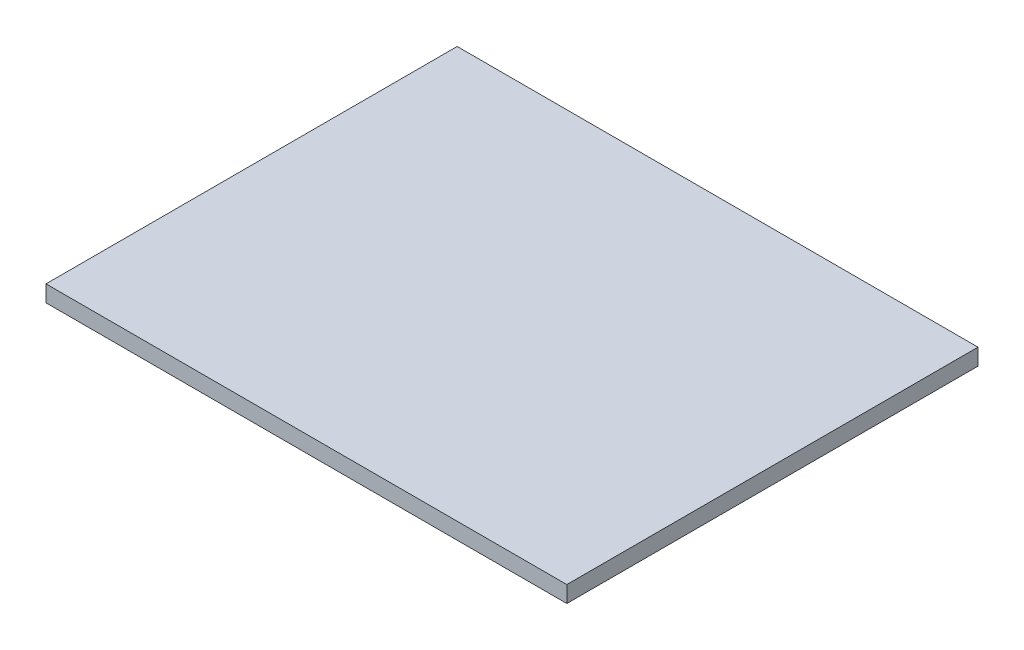
ISO-10303-21;
HEADER;
FILE_DESCRIPTION(('STEP AP214'),'2;1');
FILE_NAME('part.step','',(''),(''),'','','');
FILE_SCHEMA(('AUTOMOTIVE_DESIGN { 1 0 10303 214 1 1 1 1 }'));
ENDSEC;
DATA;
#1=APPLICATION_CONTEXT('core data for automotive mechanical design processes');
#2=APPLICATION_PROTOCOL_DEFINITION('international standard','automotive_design',2000,#1);
#3=PRODUCT_CONTEXT('',#1,'mechanical');
#4=PRODUCT('Part','Part','',(#3));
#5=PRODUCT_RELATED_PRODUCT_CATEGORY('part','',(#4));
#6=PRODUCT_DEFINITION_FORMATION('','',#4);
#7=PRODUCT_DEFINITION_CONTEXT('part definition',#1,'design');
#8=PRODUCT_DEFINITION('design','',#6,#7);
#9=PRODUCT_DEFINITION_SHAPE('','',#8);
#10=(LENGTH_UNIT() NAMED_UNIT(*) SI_UNIT(.MILLI.,.METRE.));
#11=(NAMED_UNIT(*) PLANE_ANGLE_UNIT() SI_UNIT($,.RADIAN.));
#12=(NAMED_UNIT(*) SI_UNIT($,.STERADIAN.) SOLID_ANGLE_UNIT());
#13=UNCERTAINTY_MEASURE_WITH_UNIT(LENGTH_MEASURE(1.E-05),#10,'distance_accuracy_value','');
#14=(GEOMETRIC_REPRESENTATION_CONTEXT(3) GLOBAL_UNCERTAINTY_ASSIGNED_CONTEXT((#13)) GLOBAL_UNIT_ASSIGNED_CONTEXT((#10,
#11,#12)) REPRESENTATION_CONTEXT('',''));
#15=CARTESIAN_POINT('',(0.,0.,0.));
#16=DIRECTION('',(0.,0.,1.));
#17=DIRECTION('',(1.,0.,0.));
#18=AXIS2_PLACEMENT_3D('',#15,#16,#17);
#19=CARTESIAN_POINT('',(-47.5,3.,37.5));
#20=DIRECTION('',(1.,0.,0.));
#21=DIRECTION('',(0.,0.,-1.));
#22=AXIS2_PLACEMENT_3D('',#19,#20,#21);
#23=PLANE('',#22);
#24=DIRECTION('',(0.,0.,1.));
#25=VECTOR('',#24,1.);
#26=CARTESIAN_POINT('',(-47.5,0.,37.5));
#27=LINE('',#26,#25);
#28=CARTESIAN_POINT('',(-47.5,0.,-37.5));
#29=VERTEX_POINT('',#28);
#30=CARTESIAN_POINT('',(-47.5,0.,37.5));
#31=VERTEX_POINT('',#30);
#32=EDGE_CURVE('E96',#29,#31,#27,.T.);
#33=ORIENTED_EDGE('',*,*,#32,.T.);
#34=DIRECTION('',(0.,-1.,0.));
#35=VECTOR('',#34,1.);
#36=CARTESIAN_POINT('',(-47.5,3.,37.5));
#37=LINE('',#36,#35);
#38=CARTESIAN_POINT('',(-47.5,3.,37.5));
#39=VERTEX_POINT('',#38);
#40=EDGE_CURVE('E11',#39,#31,#37,.T.);
#41=ORIENTED_EDGE('',*,*,#40,.F.);
#42=DIRECTION('',(0.,0.,1.));
#43=VECTOR('',#42,1.);
#44=CARTESIAN_POINT('',(-47.5,3.,37.5));
#45=LINE('',#44,#43);
#46=CARTESIAN_POINT('',(-47.5,3.,-37.5));
#47=VERTEX_POINT('',#46);
#48=EDGE_CURVE('E84',#47,#39,#45,.T.);
#49=ORIENTED_EDGE('',*,*,#48,.F.);
#50=DIRECTION('',(0.,-1.,0.));
#51=VECTOR('',#50,1.);
#52=CARTESIAN_POINT('',(-47.5,3.,-37.5));
#53=LINE('',#52,#51);
#54=EDGE_CURVE('E92',#47,#29,#53,.T.);
#55=ORIENTED_EDGE('',*,*,#54,.T.);
#56=EDGE_LOOP('',(#33,#41,#49,#55));
#57=FACE_BOUND('',#56,.T.);
#58=ADVANCED_FACE('F33',(#57),#23,.F.);
#59=CARTESIAN_POINT('',(47.5,3.,37.5));
#60=DIRECTION('',(0.,0.,-1.));
#61=DIRECTION('',(-1.,0.,0.));
#62=AXIS2_PLACEMENT_3D('',#59,#60,#61);
#63=PLANE('',#62);
#64=DIRECTION('',(1.,0.,0.));
#65=VECTOR('',#64,1.);
#66=CARTESIAN_POINT('',(47.5,0.,37.5));
#67=LINE('',#66,#65);
#68=CARTESIAN_POINT('',(47.5,0.,37.5));
#69=VERTEX_POINT('',#68);
#70=EDGE_CURVE('E88',#31,#69,#67,.T.);
#71=ORIENTED_EDGE('',*,*,#70,.T.);
#72=DIRECTION('',(0.,-1.,0.));
#73=VECTOR('',#72,1.);
#74=CARTESIAN_POINT('',(47.5,3.,37.5));
#75=LINE('',#74,#73);
#76=CARTESIAN_POINT('',(47.5,3.,37.5));
#77=VERTEX_POINT('',#76);
#78=EDGE_CURVE('E41',#77,#69,#75,.T.);
#79=ORIENTED_EDGE('',*,*,#78,.F.);
#80=DIRECTION('',(1.,0.,0.));
#81=VECTOR('',#80,1.);
#82=CARTESIAN_POINT('',(47.5,3.,37.5));
#83=LINE('',#82,#81);
#84=EDGE_CURVE('E79',#39,#77,#83,.T.);
#85=ORIENTED_EDGE('',*,*,#84,.F.);
#86=ORIENTED_EDGE('',*,*,#40,.T.);
#87=EDGE_LOOP('',(#71,#79,#85,#86));
#88=FACE_BOUND('',#87,.T.);
#89=ADVANCED_FACE('F87',(#88),#63,.F.);
#90=CARTESIAN_POINT('',(47.5,3.,37.5));
#91=DIRECTION('',(-1.,0.,0.));
#92=DIRECTION('',(0.,0.,1.));
#93=AXIS2_PLACEMENT_3D('',#90,#91,#92);
#94=PLANE('',#93);
#95=DIRECTION('',(0.,0.,-1.));
#96=VECTOR('',#95,1.);
#97=CARTESIAN_POINT('',(47.5,0.,37.5));
#98=LINE('',#97,#96);
#99=CARTESIAN_POINT('',(47.5,0.,-37.5));
#100=VERTEX_POINT('',#99);
#101=EDGE_CURVE('E66',#69,#100,#98,.T.);
#102=ORIENTED_EDGE('',*,*,#101,.T.);
#103=DIRECTION('',(0.,-1.,0.));
#104=VECTOR('',#103,1.);
#105=CARTESIAN_POINT('',(47.5,3.,-37.5));
#106=LINE('',#105,#104);
#107=CARTESIAN_POINT('',(47.5,3.,-37.5));
#108=VERTEX_POINT('',#107);
#109=EDGE_CURVE('E89',#108,#100,#106,.T.);
#110=ORIENTED_EDGE('',*,*,#109,.F.);
#111=DIRECTION('',(0.,0.,-1.));
#112=VECTOR('',#111,1.);
#113=CARTESIAN_POINT('',(47.5,3.,37.5));
#114=LINE('',#113,#112);
#115=EDGE_CURVE('E82',#77,#108,#114,.T.);
#116=ORIENTED_EDGE('',*,*,#115,.F.);
#117=ORIENTED_EDGE('',*,*,#78,.T.);
#118=EDGE_LOOP('',(#102,#110,#116,#117));
#119=FACE_BOUND('',#118,.T.);
#120=ADVANCED_FACE('F90',(#119),#94,.F.);
#121=CARTESIAN_POINT('',(47.5,3.,-37.5));
#122=DIRECTION('',(0.,0.,1.));
#123=DIRECTION('',(1.,0.,0.));
#124=AXIS2_PLACEMENT_3D('',#121,#122,#123);
#125=PLANE('',#124);
#126=DIRECTION('',(-1.,0.,0.));
#127=VECTOR('',#126,1.);
#128=CARTESIAN_POINT('',(47.5,0.,-37.5));
#129=LINE('',#128,#127);
#130=EDGE_CURVE('E72',#100,#29,#129,.T.);
#131=ORIENTED_EDGE('',*,*,#130,.T.);
#132=ORIENTED_EDGE('',*,*,#54,.F.);
#133=DIRECTION('',(-1.,0.,0.));
#134=VECTOR('',#133,1.);
#135=CARTESIAN_POINT('',(47.5,3.,-37.5));
#136=LINE('',#135,#134);
#137=EDGE_CURVE('E49',#108,#47,#136,.T.);
#138=ORIENTED_EDGE('',*,*,#137,.F.);
#139=ORIENTED_EDGE('',*,*,#109,.T.);
#140=EDGE_LOOP('',(#131,#132,#138,#139));
#141=FACE_BOUND('',#140,.T.);
#142=ADVANCED_FACE('F103',(#141),#125,.F.);
#143=CARTESIAN_POINT('',(0.,3.,0.));
#144=DIRECTION('',(0.,1.,0.));
#145=DIRECTION('',(0.,0.,1.));
#146=AXIS2_PLACEMENT_3D('',#143,#144,#145);
#147=PLANE('',#146);
#148=ORIENTED_EDGE('',*,*,#48,.T.);
#149=ORIENTED_EDGE('',*,*,#84,.T.);
#150=ORIENTED_EDGE('',*,*,#115,.T.);
#151=ORIENTED_EDGE('',*,*,#137,.T.);
#152=EDGE_LOOP('',(#148,#149,#150,#151));
#153=FACE_BOUND('',#152,.T.);
#154=ADVANCED_FACE('F80',(#153),#147,.T.);
#155=CARTESIAN_POINT('',(0.,0.,0.));
#156=DIRECTION('',(0.,1.,0.));
#157=DIRECTION('',(0.,0.,1.));
#158=AXIS2_PLACEMENT_3D('',#155,#156,#157);
#159=PLANE('',#158);
#160=ORIENTED_EDGE('',*,*,#32,.F.);
#161=ORIENTED_EDGE('',*,*,#130,.F.);
#162=ORIENTED_EDGE('',*,*,#101,.F.);
#163=ORIENTED_EDGE('',*,*,#70,.F.);
#164=EDGE_LOOP('',(#160,#161,#162,#163));
#165=FACE_BOUND('',#164,.T.);
#166=ADVANCED_FACE('F106',(#165),#159,.F.);
#167=CLOSED_SHELL('',(#58,#89,#120,#142,#154,#166));
#168=MANIFOLD_SOLID_BREP('B2',#167);
#169=ADVANCED_BREP_SHAPE_REPRESENTATION('',(#18,#168),#14);
#170=SHAPE_DEFINITION_REPRESENTATION(#9,#169);
ENDSEC;
END-ISO-10303-21;
